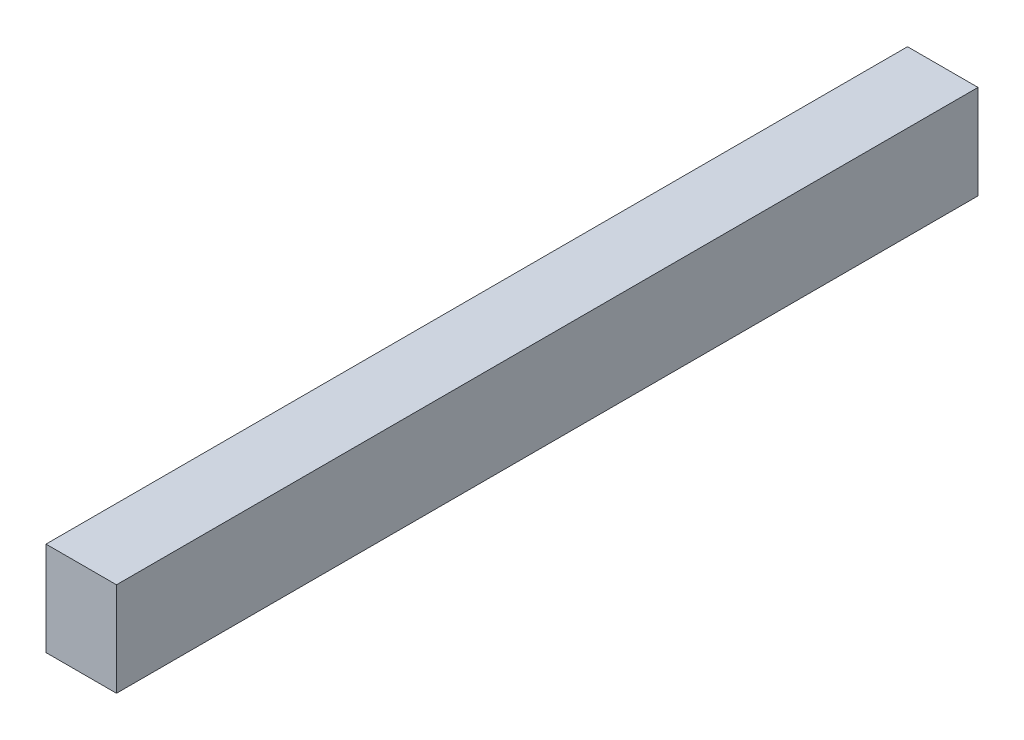
ISO-10303-21;
HEADER;
FILE_DESCRIPTION(('STEP AP214'),'2;1');
FILE_NAME('part.step','',(''),(''),'','','');
FILE_SCHEMA(('AUTOMOTIVE_DESIGN { 1 0 10303 214 1 1 1 1 }'));
ENDSEC;
DATA;
#1=APPLICATION_CONTEXT('core data for automotive mechanical design processes');
#2=APPLICATION_PROTOCOL_DEFINITION('international standard','automotive_design',2000,#1);
#3=PRODUCT_CONTEXT('',#1,'mechanical');
#4=PRODUCT('Part','Part','',(#3));
#5=PRODUCT_RELATED_PRODUCT_CATEGORY('part','',(#4));
#6=PRODUCT_DEFINITION_FORMATION('','',#4);
#7=PRODUCT_DEFINITION_CONTEXT('part definition',#1,'design');
#8=PRODUCT_DEFINITION('design','',#6,#7);
#9=PRODUCT_DEFINITION_SHAPE('','',#8);
#10=(LENGTH_UNIT() NAMED_UNIT(*) SI_UNIT(.MILLI.,.METRE.));
#11=(NAMED_UNIT(*) PLANE_ANGLE_UNIT() SI_UNIT($,.RADIAN.));
#12=(NAMED_UNIT(*) SI_UNIT($,.STERADIAN.) SOLID_ANGLE_UNIT());
#13=UNCERTAINTY_MEASURE_WITH_UNIT(LENGTH_MEASURE(1.E-05),#10,'distance_accuracy_value','');
#14=(GEOMETRIC_REPRESENTATION_CONTEXT(3) GLOBAL_UNCERTAINTY_ASSIGNED_CONTEXT((#13)) GLOBAL_UNIT_ASSIGNED_CONTEXT((#10,
#11,#12)) REPRESENTATION_CONTEXT('',''));
#15=CARTESIAN_POINT('',(0.,0.,0.));
#16=DIRECTION('',(0.,0.,1.));
#17=DIRECTION('',(1.,0.,0.));
#18=AXIS2_PLACEMENT_3D('',#15,#16,#17);
#19=CARTESIAN_POINT('',(77.,-28.,0.));
#20=DIRECTION('',(0.,1.,0.));
#21=DIRECTION('',(0.,0.,1.));
#22=AXIS2_PLACEMENT_3D('',#19,#20,#21);
#23=PLANE('',#22);
#24=DIRECTION('',(1.,0.,0.));
#25=VECTOR('',#24,1.);
#26=CARTESIAN_POINT('',(77.,-28.,-110.));
#27=LINE('',#26,#25);
#28=CARTESIAN_POINT('',(68.,-28.,-110.));
#29=VERTEX_POINT('',#28);
#30=CARTESIAN_POINT('',(77.,-28.,-110.));
#31=VERTEX_POINT('',#30);
#32=EDGE_CURVE('E100',#29,#31,#27,.T.);
#33=ORIENTED_EDGE('',*,*,#32,.F.);
#34=DIRECTION('',(0.,0.,-1.));
#35=VECTOR('',#34,1.);
#36=CARTESIAN_POINT('',(68.,-28.,0.));
#37=LINE('',#36,#35);
#38=CARTESIAN_POINT('',(68.,-28.,0.));
#39=VERTEX_POINT('',#38);
#40=EDGE_CURVE('E11',#39,#29,#37,.T.);
#41=ORIENTED_EDGE('',*,*,#40,.F.);
#42=DIRECTION('',(1.,0.,0.));
#43=VECTOR('',#42,1.);
#44=CARTESIAN_POINT('',(77.,-28.,0.));
#45=LINE('',#44,#43);
#46=CARTESIAN_POINT('',(77.,-28.,0.));
#47=VERTEX_POINT('',#46);
#48=EDGE_CURVE('E94',#39,#47,#45,.T.);
#49=ORIENTED_EDGE('',*,*,#48,.T.);
#50=DIRECTION('',(0.,0.,-1.));
#51=VECTOR('',#50,1.);
#52=CARTESIAN_POINT('',(77.,-28.,0.));
#53=LINE('',#52,#51);
#54=EDGE_CURVE('E39',#47,#31,#53,.T.);
#55=ORIENTED_EDGE('',*,*,#54,.T.);
#56=EDGE_LOOP('',(#33,#41,#49,#55));
#57=FACE_BOUND('',#56,.T.);
#58=ADVANCED_FACE('F36',(#57),#23,.T.);
#59=CARTESIAN_POINT('',(68.,-28.,0.));
#60=DIRECTION('',(-1.,0.,0.));
#61=DIRECTION('',(0.,0.,1.));
#62=AXIS2_PLACEMENT_3D('',#59,#60,#61);
#63=PLANE('',#62);
#64=DIRECTION('',(0.,1.,0.));
#65=VECTOR('',#64,1.);
#66=CARTESIAN_POINT('',(68.,-28.,-110.));
#67=LINE('',#66,#65);
#68=CARTESIAN_POINT('',(68.,-40.,-110.));
#69=VERTEX_POINT('',#68);
#70=EDGE_CURVE('E96',#69,#29,#67,.T.);
#71=ORIENTED_EDGE('',*,*,#70,.F.);
#72=DIRECTION('',(0.,0.,-1.));
#73=VECTOR('',#72,1.);
#74=CARTESIAN_POINT('',(68.,-40.,0.));
#75=LINE('',#74,#73);
#76=CARTESIAN_POINT('',(68.,-40.,0.));
#77=VERTEX_POINT('',#76);
#78=EDGE_CURVE('E45',#77,#69,#75,.T.);
#79=ORIENTED_EDGE('',*,*,#78,.F.);
#80=DIRECTION('',(0.,1.,0.));
#81=VECTOR('',#80,1.);
#82=CARTESIAN_POINT('',(68.,-28.,0.));
#83=LINE('',#82,#81);
#84=EDGE_CURVE('E91',#77,#39,#83,.T.);
#85=ORIENTED_EDGE('',*,*,#84,.T.);
#86=ORIENTED_EDGE('',*,*,#40,.T.);
#87=EDGE_LOOP('',(#71,#79,#85,#86));
#88=FACE_BOUND('',#87,.T.);
#89=ADVANCED_FACE('F110',(#88),#63,.T.);
#90=CARTESIAN_POINT('',(77.,-40.,0.));
#91=DIRECTION('',(0.,-1.,0.));
#92=DIRECTION('',(1.,0.,0.));
#93=AXIS2_PLACEMENT_3D('',#90,#91,#92);
#94=PLANE('',#93);
#95=DIRECTION('',(-1.,0.,0.));
#96=VECTOR('',#95,1.);
#97=CARTESIAN_POINT('',(77.,-40.,-110.));
#98=LINE('',#97,#96);
#99=CARTESIAN_POINT('',(77.,-40.,-110.));
#100=VERTEX_POINT('',#99);
#101=EDGE_CURVE('E86',#100,#69,#98,.T.);
#102=ORIENTED_EDGE('',*,*,#101,.F.);
#103=DIRECTION('',(0.,0.,-1.));
#104=VECTOR('',#103,1.);
#105=CARTESIAN_POINT('',(77.,-40.,0.));
#106=LINE('',#105,#104);
#107=CARTESIAN_POINT('',(77.,-40.,0.));
#108=VERTEX_POINT('',#107);
#109=EDGE_CURVE('E81',#108,#100,#106,.T.);
#110=ORIENTED_EDGE('',*,*,#109,.F.);
#111=DIRECTION('',(-1.,0.,0.));
#112=VECTOR('',#111,1.);
#113=CARTESIAN_POINT('',(77.,-40.,0.));
#114=LINE('',#113,#112);
#115=EDGE_CURVE('E84',#108,#77,#114,.T.);
#116=ORIENTED_EDGE('',*,*,#115,.T.);
#117=ORIENTED_EDGE('',*,*,#78,.T.);
#118=EDGE_LOOP('',(#102,#110,#116,#117));
#119=FACE_BOUND('',#118,.T.);
#120=ADVANCED_FACE('F83',(#119),#94,.T.);
#121=CARTESIAN_POINT('',(77.,-40.,0.));
#122=DIRECTION('',(1.,0.,0.));
#123=DIRECTION('',(0.,0.,-1.));
#124=AXIS2_PLACEMENT_3D('',#121,#122,#123);
#125=PLANE('',#124);
#126=DIRECTION('',(0.,-1.,0.));
#127=VECTOR('',#126,1.);
#128=CARTESIAN_POINT('',(77.,-40.,-110.));
#129=LINE('',#128,#127);
#130=EDGE_CURVE('E103',#31,#100,#129,.T.);
#131=ORIENTED_EDGE('',*,*,#130,.F.);
#132=ORIENTED_EDGE('',*,*,#54,.F.);
#133=DIRECTION('',(0.,-1.,0.));
#134=VECTOR('',#133,1.);
#135=CARTESIAN_POINT('',(77.,-40.,0.));
#136=LINE('',#135,#134);
#137=EDGE_CURVE('E90',#47,#108,#136,.T.);
#138=ORIENTED_EDGE('',*,*,#137,.T.);
#139=ORIENTED_EDGE('',*,*,#109,.T.);
#140=EDGE_LOOP('',(#131,#132,#138,#139));
#141=FACE_BOUND('',#140,.T.);
#142=ADVANCED_FACE('F93',(#141),#125,.T.);
#143=CARTESIAN_POINT('',(0.,0.,0.));
#144=DIRECTION('',(0.,0.,1.));
#145=DIRECTION('',(1.,0.,0.));
#146=AXIS2_PLACEMENT_3D('',#143,#144,#145);
#147=PLANE('',#146);
#148=ORIENTED_EDGE('',*,*,#48,.F.);
#149=ORIENTED_EDGE('',*,*,#84,.F.);
#150=ORIENTED_EDGE('',*,*,#115,.F.);
#151=ORIENTED_EDGE('',*,*,#137,.F.);
#152=EDGE_LOOP('',(#148,#149,#150,#151));
#153=FACE_BOUND('',#152,.T.);
#154=ADVANCED_FACE('F89',(#153),#147,.T.);
#155=CARTESIAN_POINT('',(0.,0.,-110.));
#156=DIRECTION('',(0.,0.,1.));
#157=DIRECTION('',(1.,0.,0.));
#158=AXIS2_PLACEMENT_3D('',#155,#156,#157);
#159=PLANE('',#158);
#160=ORIENTED_EDGE('',*,*,#32,.T.);
#161=ORIENTED_EDGE('',*,*,#130,.T.);
#162=ORIENTED_EDGE('',*,*,#101,.T.);
#163=ORIENTED_EDGE('',*,*,#70,.T.);
#164=EDGE_LOOP('',(#160,#161,#162,#163));
#165=FACE_BOUND('',#164,.T.);
#166=ADVANCED_FACE('F109',(#165),#159,.F.);
#167=CLOSED_SHELL('',(#58,#89,#120,#142,#154,#166));
#168=MANIFOLD_SOLID_BREP('B2',#167);
#169=ADVANCED_BREP_SHAPE_REPRESENTATION('',(#18,#168),#14);
#170=SHAPE_DEFINITION_REPRESENTATION(#9,#169);
ENDSEC;
END-ISO-10303-21;
